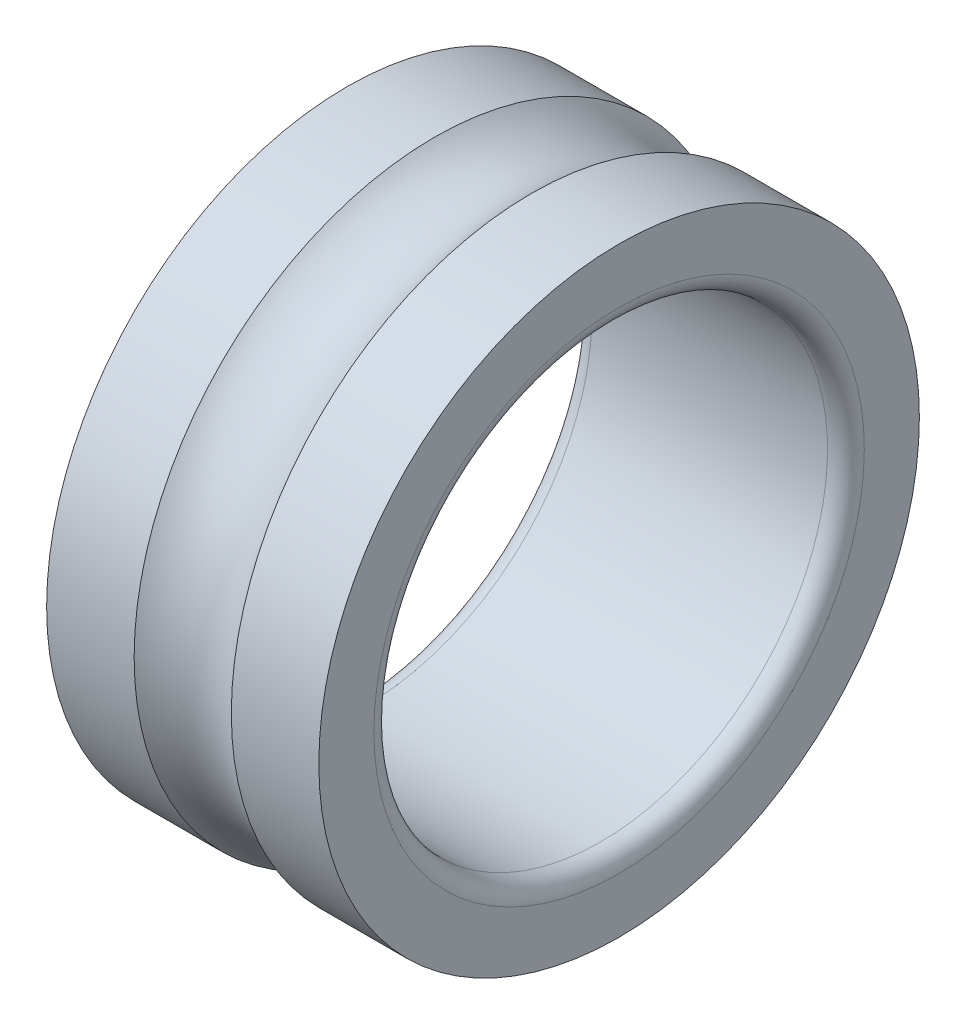
ISO-10303-21;
HEADER;
FILE_DESCRIPTION(('STEP AP214'),'2;1');
FILE_NAME('part.step','',(''),(''),'','','');
FILE_SCHEMA(('AUTOMOTIVE_DESIGN { 1 0 10303 214 1 1 1 1 }'));
ENDSEC;
DATA;
#1=APPLICATION_CONTEXT('core data for automotive mechanical design processes');
#2=APPLICATION_PROTOCOL_DEFINITION('international standard','automotive_design',2000,#1);
#3=PRODUCT_CONTEXT('',#1,'mechanical');
#4=PRODUCT('Part','Part','',(#3));
#5=PRODUCT_RELATED_PRODUCT_CATEGORY('part','',(#4));
#6=PRODUCT_DEFINITION_FORMATION('','',#4);
#7=PRODUCT_DEFINITION_CONTEXT('part definition',#1,'design');
#8=PRODUCT_DEFINITION('design','',#6,#7);
#9=PRODUCT_DEFINITION_SHAPE('','',#8);
#10=(LENGTH_UNIT() NAMED_UNIT(*) SI_UNIT(.MILLI.,.METRE.));
#11=(NAMED_UNIT(*) PLANE_ANGLE_UNIT() SI_UNIT($,.RADIAN.));
#12=(NAMED_UNIT(*) SI_UNIT($,.STERADIAN.) SOLID_ANGLE_UNIT());
#13=UNCERTAINTY_MEASURE_WITH_UNIT(LENGTH_MEASURE(1.E-05),#10,'distance_accuracy_value','');
#14=(GEOMETRIC_REPRESENTATION_CONTEXT(3) GLOBAL_UNCERTAINTY_ASSIGNED_CONTEXT((#13)) GLOBAL_UNIT_ASSIGNED_CONTEXT((#10,
#11,#12)) REPRESENTATION_CONTEXT('',''));
#15=CARTESIAN_POINT('',(0.,0.,0.));
#16=DIRECTION('',(0.,0.,1.));
#17=DIRECTION('',(1.,0.,0.));
#18=AXIS2_PLACEMENT_3D('',#15,#16,#17);
#19=CARTESIAN_POINT('',(0.,0.,0.));
#20=DIRECTION('',(-1.,0.,0.));
#21=DIRECTION('',(0.,0.,1.));
#22=AXIS2_PLACEMENT_3D('',#19,#20,#21);
#23=CYLINDRICAL_SURFACE('',#22,9.92857142857143);
#24=CARTESIAN_POINT('',(1.60634901028922,0.,0.));
#25=DIRECTION('',(-1.,0.,0.));
#26=DIRECTION('',(0.,0.,1.));
#27=AXIS2_PLACEMENT_3D('',#24,#25,#26);
#28=CIRCLE('',#27,9.92857142857143);
#29=CARTESIAN_POINT('',(1.60634901028922,0.,9.92857142857143));
#30=VERTEX_POINT('',#29);
#31=EDGE_CURVE('E376',#30,#30,#28,.T.);
#32=ORIENTED_EDGE('',*,*,#31,.F.);
#33=EDGE_LOOP('',(#32));
#34=FACE_BOUND('',#33,.T.);
#35=CARTESIAN_POINT('',(4.5,0.,0.));
#36=DIRECTION('',(-1.,0.,0.));
#37=DIRECTION('',(0.,0.,1.));
#38=AXIS2_PLACEMENT_3D('',#35,#36,#37);
#39=CIRCLE('',#38,9.92857142857143);
#40=CARTESIAN_POINT('',(4.5,0.,9.92857142857143));
#41=VERTEX_POINT('',#40);
#42=EDGE_CURVE('E10',#41,#41,#39,.T.);
#43=ORIENTED_EDGE('',*,*,#42,.T.);
#44=EDGE_LOOP('',(#43));
#45=FACE_BOUND('',#44,.T.);
#46=ADVANCED_FACE('F348',(#34,#45),#23,.T.);
#47=CARTESIAN_POINT('',(4.5,8.10714285714286,0.));
#48=DIRECTION('',(-1.,0.,0.));
#49=DIRECTION('',(0.,0.,1.));
#50=AXIS2_PLACEMENT_3D('',#47,#48,#49);
#51=PLANE('',#50);
#52=ORIENTED_EDGE('',*,*,#42,.F.);
#53=EDGE_LOOP('',(#52));
#54=FACE_BOUND('',#53,.T.);
#55=CARTESIAN_POINT('',(4.5,0.,0.));
#56=DIRECTION('',(-1.,0.,0.));
#57=DIRECTION('',(0.,0.,1.));
#58=AXIS2_PLACEMENT_3D('',#55,#56,#57);
#59=CIRCLE('',#58,8.10714285714286);
#60=CARTESIAN_POINT('',(4.5,0.,8.10714285714286));
#61=VERTEX_POINT('',#60);
#62=EDGE_CURVE('E354',#61,#61,#59,.T.);
#63=ORIENTED_EDGE('',*,*,#62,.T.);
#64=EDGE_LOOP('',(#63));
#65=FACE_BOUND('',#64,.T.);
#66=ADVANCED_FACE('F383',(#54,#65),#51,.F.);
#67=CARTESIAN_POINT('',(3.89285714285714,0.,0.));
#68=DIRECTION('',(-1.,0.,0.));
#69=DIRECTION('',(0.,0.,1.));
#70=AXIS2_PLACEMENT_3D('',#67,#68,#69);
#71=TOROIDAL_SURFACE('',#70,8.10714285714286,0.607142857142857);
#72=ORIENTED_EDGE('',*,*,#62,.F.);
#73=EDGE_LOOP('',(#72));
#74=FACE_BOUND('',#73,.T.);
#75=CARTESIAN_POINT('',(3.89285714285714,0.,0.));
#76=DIRECTION('',(-1.,0.,0.));
#77=DIRECTION('',(0.,0.,1.));
#78=AXIS2_PLACEMENT_3D('',#75,#76,#77);
#79=CIRCLE('',#78,7.5);
#80=CARTESIAN_POINT('',(3.89285714285714,0.,7.5));
#81=VERTEX_POINT('',#80);
#82=EDGE_CURVE('E358',#81,#81,#79,.T.);
#83=ORIENTED_EDGE('',*,*,#82,.T.);
#84=EDGE_LOOP('',(#83));
#85=FACE_BOUND('',#84,.T.);
#86=ADVANCED_FACE('F387',(#74,#85),#71,.T.);
#87=CARTESIAN_POINT('',(0.,0.,0.));
#88=DIRECTION('',(-1.,0.,0.));
#89=DIRECTION('',(0.,0.,1.));
#90=AXIS2_PLACEMENT_3D('',#87,#88,#89);
#91=CYLINDRICAL_SURFACE('',#90,7.5);
#92=ORIENTED_EDGE('',*,*,#82,.F.);
#93=EDGE_LOOP('',(#92));
#94=FACE_BOUND('',#93,.T.);
#95=CARTESIAN_POINT('',(-3.89285714285714,0.,0.));
#96=DIRECTION('',(-1.,0.,0.));
#97=DIRECTION('',(0.,0.,1.));
#98=AXIS2_PLACEMENT_3D('',#95,#96,#97);
#99=CIRCLE('',#98,7.5);
#100=CARTESIAN_POINT('',(-3.89285714285714,0.,7.5));
#101=VERTEX_POINT('',#100);
#102=EDGE_CURVE('E362',#101,#101,#99,.T.);
#103=ORIENTED_EDGE('',*,*,#102,.T.);
#104=EDGE_LOOP('',(#103));
#105=FACE_BOUND('',#104,.T.);
#106=ADVANCED_FACE('F392',(#94,#105),#91,.F.);
#107=CARTESIAN_POINT('',(-3.89285714285714,0.,0.));
#108=DIRECTION('',(-1.,0.,0.));
#109=DIRECTION('',(0.,0.,1.));
#110=AXIS2_PLACEMENT_3D('',#107,#108,#109);
#111=TOROIDAL_SURFACE('',#110,8.10714285714286,0.607142857142857);
#112=ORIENTED_EDGE('',*,*,#102,.F.);
#113=EDGE_LOOP('',(#112));
#114=FACE_BOUND('',#113,.T.);
#115=CARTESIAN_POINT('',(-4.5,0.,0.));
#116=DIRECTION('',(-1.,0.,0.));
#117=DIRECTION('',(0.,0.,1.));
#118=AXIS2_PLACEMENT_3D('',#115,#116,#117);
#119=CIRCLE('',#118,8.10714285714286);
#120=CARTESIAN_POINT('',(-4.5,0.,8.10714285714286));
#121=VERTEX_POINT('',#120);
#122=EDGE_CURVE('E367',#121,#121,#119,.T.);
#123=ORIENTED_EDGE('',*,*,#122,.T.);
#124=EDGE_LOOP('',(#123));
#125=FACE_BOUND('',#124,.T.);
#126=ADVANCED_FACE('F398',(#114,#125),#111,.T.);
#127=CARTESIAN_POINT('',(-4.5,8.10714285714286,0.));
#128=DIRECTION('',(1.,0.,0.));
#129=DIRECTION('',(0.,0.,-1.));
#130=AXIS2_PLACEMENT_3D('',#127,#128,#129);
#131=PLANE('',#130);
#132=ORIENTED_EDGE('',*,*,#122,.F.);
#133=EDGE_LOOP('',(#132));
#134=FACE_BOUND('',#133,.T.);
#135=CARTESIAN_POINT('',(-4.5,0.,0.));
#136=DIRECTION('',(-1.,0.,0.));
#137=DIRECTION('',(0.,0.,1.));
#138=AXIS2_PLACEMENT_3D('',#135,#136,#137);
#139=CIRCLE('',#138,9.92857142857143);
#140=CARTESIAN_POINT('',(-4.5,0.,9.92857142857143));
#141=VERTEX_POINT('',#140);
#142=EDGE_CURVE('E370',#141,#141,#139,.T.);
#143=ORIENTED_EDGE('',*,*,#142,.T.);
#144=EDGE_LOOP('',(#143));
#145=FACE_BOUND('',#144,.T.);
#146=ADVANCED_FACE('F402',(#134,#145),#131,.F.);
#147=CARTESIAN_POINT('',(0.,0.,0.));
#148=DIRECTION('',(-1.,0.,0.));
#149=DIRECTION('',(0.,0.,1.));
#150=AXIS2_PLACEMENT_3D('',#147,#148,#149);
#151=CYLINDRICAL_SURFACE('',#150,9.92857142857143);
#152=ORIENTED_EDGE('',*,*,#142,.F.);
#153=EDGE_LOOP('',(#152));
#154=FACE_BOUND('',#153,.T.);
#155=CARTESIAN_POINT('',(-1.60634901028922,0.,0.));
#156=DIRECTION('',(-1.,0.,0.));
#157=DIRECTION('',(0.,0.,1.));
#158=AXIS2_PLACEMENT_3D('',#155,#156,#157);
#159=CIRCLE('',#158,9.92857142857143);
#160=CARTESIAN_POINT('',(-1.60634901028922,0.,9.92857142857143));
#161=VERTEX_POINT('',#160);
#162=EDGE_CURVE('E373',#161,#161,#159,.T.);
#163=ORIENTED_EDGE('',*,*,#162,.T.);
#164=EDGE_LOOP('',(#163));
#165=FACE_BOUND('',#164,.T.);
#166=ADVANCED_FACE('F406',(#154,#165),#151,.T.);
#167=CARTESIAN_POINT('',(0.,0.,0.));
#168=DIRECTION('',(-1.,0.,0.));
#169=DIRECTION('',(0.,0.,1.));
#170=AXIS2_PLACEMENT_3D('',#167,#168,#169);
#171=TOROIDAL_SURFACE('',#170,11.75,2.42857142857143);
#172=ORIENTED_EDGE('',*,*,#162,.F.);
#173=EDGE_LOOP('',(#172));
#174=FACE_BOUND('',#173,.T.);
#175=ORIENTED_EDGE('',*,*,#31,.T.);
#176=EDGE_LOOP('',(#175));
#177=FACE_BOUND('',#176,.T.);
#178=ADVANCED_FACE('F380',(#174,#177),#171,.F.);
#179=CLOSED_SHELL('',(#46,#66,#86,#106,#126,#146,#166,#178));
#180=MANIFOLD_SOLID_BREP('B2',#179);
#181=ADVANCED_BREP_SHAPE_REPRESENTATION('',(#18,#180),#14);
#182=SHAPE_DEFINITION_REPRESENTATION(#9,#181);
ENDSEC;
END-ISO-10303-21;
